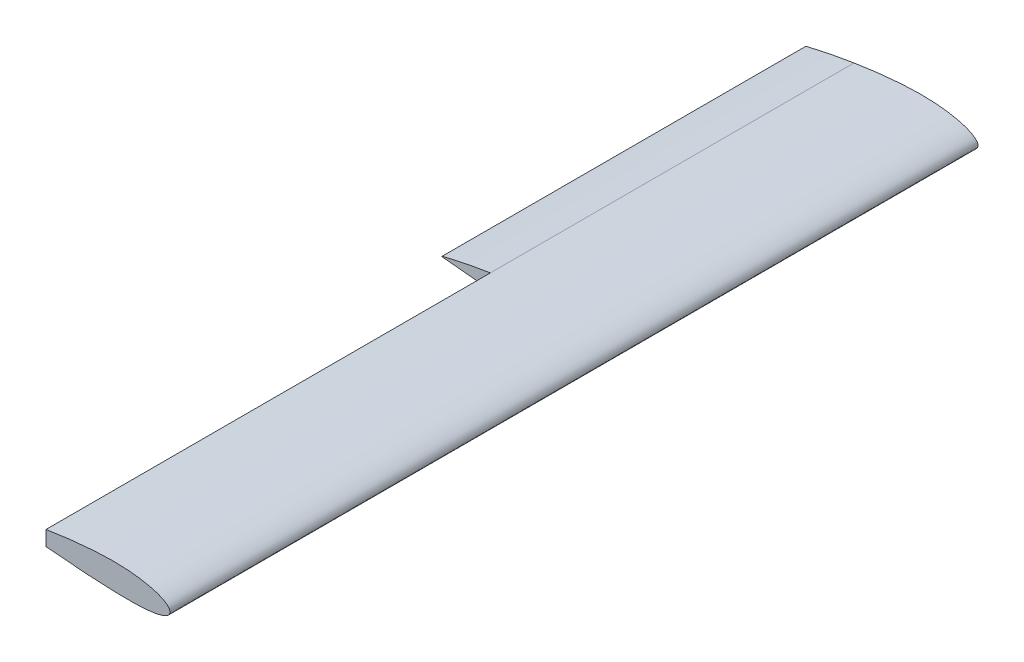
ISO-10303-21;
HEADER;
FILE_DESCRIPTION(('STEP AP214'),'2;1');
FILE_NAME('part.step','',(''),(''),'','','');
FILE_SCHEMA(('AUTOMOTIVE_DESIGN { 1 0 10303 214 1 1 1 1 }'));
ENDSEC;
DATA;
#1=APPLICATION_CONTEXT('core data for automotive mechanical design processes');
#2=APPLICATION_PROTOCOL_DEFINITION('international standard','automotive_design',2000,#1);
#3=PRODUCT_CONTEXT('',#1,'mechanical');
#4=PRODUCT('Part','Part','',(#3));
#5=PRODUCT_RELATED_PRODUCT_CATEGORY('part','',(#4));
#6=PRODUCT_DEFINITION_FORMATION('','',#4);
#7=PRODUCT_DEFINITION_CONTEXT('part definition',#1,'design');
#8=PRODUCT_DEFINITION('design','',#6,#7);
#9=PRODUCT_DEFINITION_SHAPE('','',#8);
#10=(LENGTH_UNIT() NAMED_UNIT(*) SI_UNIT(.MILLI.,.METRE.));
#11=(NAMED_UNIT(*) PLANE_ANGLE_UNIT() SI_UNIT($,.RADIAN.));
#12=(NAMED_UNIT(*) SI_UNIT($,.STERADIAN.) SOLID_ANGLE_UNIT());
#13=UNCERTAINTY_MEASURE_WITH_UNIT(LENGTH_MEASURE(1.E-05),#10,'distance_accuracy_value','');
#14=(GEOMETRIC_REPRESENTATION_CONTEXT(3) GLOBAL_UNCERTAINTY_ASSIGNED_CONTEXT((#13)) GLOBAL_UNIT_ASSIGNED_CONTEXT((#10,
#11,#12)) REPRESENTATION_CONTEXT('',''));
#15=CARTESIAN_POINT('',(0.,0.,0.));
#16=DIRECTION('',(0.,0.,1.));
#17=DIRECTION('',(1.,0.,0.));
#18=AXIS2_PLACEMENT_3D('',#15,#16,#17);
#19=CARTESIAN_POINT('',(-171.846,13.8024377947117,1120.));
#20=DIRECTION('',(1.,0.,0.));
#21=DIRECTION('',(0.,0.,-1.));
#22=AXIS2_PLACEMENT_3D('',#19,#20,#21);
#23=PLANE('',#22);
#24=DIRECTION('',(0.,1.,0.));
#25=VECTOR('',#24,1.);
#26=CARTESIAN_POINT('',(-171.846,13.8024377947117,504.));
#27=LINE('',#26,#25);
#28=CARTESIAN_POINT('',(-171.846,-6.8859458174672,504.));
#29=VERTEX_POINT('',#28);
#30=CARTESIAN_POINT('',(-171.846,13.8024377947117,504.));
#31=VERTEX_POINT('',#30);
#32=EDGE_CURVE('E63',#29,#31,#27,.T.);
#33=ORIENTED_EDGE('',*,*,#32,.F.);
#34=DIRECTION('',(0.,0.,-1.));
#35=VECTOR('',#34,1.);
#36=CARTESIAN_POINT('',(-171.846,-6.8859458174672,1120.));
#37=LINE('',#36,#35);
#38=CARTESIAN_POINT('',(-171.846,-6.8859458174672,1120.));
#39=VERTEX_POINT('',#38);
#40=EDGE_CURVE('E49',#39,#29,#37,.T.);
#41=ORIENTED_EDGE('',*,*,#40,.F.);
#42=DIRECTION('',(0.,-1.,0.));
#43=VECTOR('',#42,1.);
#44=CARTESIAN_POINT('',(-171.846,13.8024377947117,1120.));
#45=LINE('',#44,#43);
#46=CARTESIAN_POINT('',(-171.846,13.8024377947117,1120.));
#47=VERTEX_POINT('',#46);
#48=EDGE_CURVE('E124',#47,#39,#45,.T.);
#49=ORIENTED_EDGE('',*,*,#48,.F.);
#50=DIRECTION('',(0.,0.,-1.));
#51=VECTOR('',#50,1.);
#52=CARTESIAN_POINT('',(-171.846,13.8024377947117,1120.));
#53=LINE('',#52,#51);
#54=EDGE_CURVE('E11',#47,#31,#53,.T.);
#55=ORIENTED_EDGE('',*,*,#54,.T.);
#56=EDGE_LOOP('',(#33,#41,#49,#55));
#57=FACE_BOUND('',#56,.T.);
#58=ADVANCED_FACE('F39',(#57),#23,.F.);
#59=CARTESIAN_POINT('',(-171.846,-6.8859458174672,1120.));
#60=CARTESIAN_POINT('',(-169.445500495057,-7.10059578031412,1120.));
#61=CARTESIAN_POINT('',(-164.120854312164,-7.57671964660847,1120.));
#62=CARTESIAN_POINT('',(-155.798515887061,-8.29774530729197,1120.));
#63=CARTESIAN_POINT('',(-146.82606609712,-9.05269906799401,1120.));
#64=CARTESIAN_POINT('',(-137.692554641866,-9.79026887636794,1120.));
#65=CARTESIAN_POINT('',(-128.453974412743,-10.4981972349087,1120.));
#66=CARTESIAN_POINT('',(-119.166555289154,-11.1621144962876,1120.));
#67=CARTESIAN_POINT('',(-109.88649318211,-11.7661976574275,1120.));
#68=CARTESIAN_POINT('',(-100.683075099608,-12.2946554630794,1120.));
#69=CARTESIAN_POINT('',(-91.6285836977069,-12.7253438577782,1120.));
#70=CARTESIAN_POINT('',(-82.7786921862933,-13.0968894741235,1120.));
#71=CARTESIAN_POINT('',(-74.1699867938844,-13.3842580555591,1120.));
#72=CARTESIAN_POINT('',(-65.8334260635804,-13.5712530139767,1120.));
#73=CARTESIAN_POINT('',(-57.8154332591305,-13.6399608708484,1120.));
#74=CARTESIAN_POINT('',(-50.160721884091,-13.5749224951301,1120.));
#75=CARTESIAN_POINT('',(-42.9121901914159,-13.3629694310149,1120.));
#76=CARTESIAN_POINT('',(-36.1108446538748,-12.9938007179074,1120.));
#77=CARTESIAN_POINT('',(-29.7956590255382,-12.4601537182947,1120.));
#78=CARTESIAN_POINT('',(-24.0033555478795,-11.7578375462022,1120.));
#79=CARTESIAN_POINT('',(-18.7680656078937,-10.8855390450986,1120.));
#80=CARTESIAN_POINT('',(-14.1208062248208,-9.84441937275084,1120.));
#81=CARTESIAN_POINT('',(-10.0886886233779,-8.63729436639388,1120.));
#82=CARTESIAN_POINT('',(-6.69372832298311,-7.26730024454799,1120.));
#83=CARTESIAN_POINT('',(-3.95171243941144,-5.73405902049488,1120.));
#84=CARTESIAN_POINT('',(-1.87387651663263,-4.02782014238744,1120.));
#85=CARTESIAN_POINT('',(-0.485118951259673,-2.11664836578969,1120.));
#86=CARTESIAN_POINT('',(0.129841681260914,-0.0130409179100886,1120.));
#87=CARTESIAN_POINT('',(-0.0566600176232738,2.17249369177211,1120.));
#88=CARTESIAN_POINT('',(-1.05224478430025,4.32261053654658,1120.));
#89=CARTESIAN_POINT('',(-2.78315758748847,6.40154054100684,1120.));
#90=CARTESIAN_POINT('',(-5.22523940459049,8.42890404838555,1120.));
#91=CARTESIAN_POINT('',(-8.3724883945445,10.4021399743308,1120.));
#92=CARTESIAN_POINT('',(-12.2151870573469,12.3056413318673,1120.));
#93=CARTESIAN_POINT('',(-16.7366506098346,14.1166483874969,1120.));
#94=CARTESIAN_POINT('',(-21.913282388799,15.8098332439343,1120.));
#95=CARTESIAN_POINT('',(-27.7153397349146,17.359414779143,1120.));
#96=CARTESIAN_POINT('',(-34.1074981398127,18.7407339465614,1120.));
#97=CARTESIAN_POINT('',(-41.0493501705292,19.9313959586649,1120.));
#98=CARTESIAN_POINT('',(-48.4958757217512,20.9121858558274,1120.));
#99=CARTESIAN_POINT('',(-56.397940476582,21.6677691129187,1120.));
#100=CARTESIAN_POINT('',(-64.7028285837109,22.1871146204139,1120.));
#101=CARTESIAN_POINT('',(-73.3548325723631,22.4639290080596,1120.));
#102=CARTESIAN_POINT('',(-82.2957901982589,22.4959698610246,1120.));
#103=CARTESIAN_POINT('',(-91.448634266557,22.2881550631337,1120.));
#104=CARTESIAN_POINT('',(-100.738687872728,21.8426120642163,1120.));
#105=CARTESIAN_POINT('',(-110.108636731325,21.2290146035072,1120.));
#106=CARTESIAN_POINT('',(-119.5167801635,20.4575897190678,1120.));
#107=CARTESIAN_POINT('',(-128.917260910405,19.5454918191666,1120.));
#108=CARTESIAN_POINT('',(-138.251119140644,18.509863587233,1120.));
#109=CARTESIAN_POINT('',(-147.460336342519,17.3704046575815,1120.));
#110=CARTESIAN_POINT('',(-156.487198096307,16.1422536028045,1120.));
#111=CARTESIAN_POINT('',(-164.597904490877,14.9579757724246,1120.));
#112=CARTESIAN_POINT('',(-169.687195915418,14.1466082189336,1120.));
#113=CARTESIAN_POINT('',(-171.846,13.8024377947117,1120.));
#114=B_SPLINE_CURVE_WITH_KNOTS('',3,(#59,#60,#61,#62,#63,#64,#65,#66,#67,#68,#69,#70,#71,#72,
#73,#74,#75,#76,#77,#78,#79,#80,#81,#82,#83,#84,#85,#86,#87,#88,#89,#90,#91,#92,#93,#94,#95,#96,
#97,#98,#99,#100,#101,#102,#103,#104,#105,#106,#107,#108,#109,#110,#111,#112,#113),
.UNSPECIFIED.,.F.,.F.,(4,1,1,1,1,1,1,1,1,1,1,1,1,1,1,1,1,1,1,1,1,1,1,1,1,1,1,1,1,1,1,1,1,1,1,1,
1,1,1,1,1,1,1,1,1,1,1,1,1,1,1,1,4),(0.,0.0203123247552929,0.0450555987415345,0.07040400679398,
0.0961999993885911,0.122283996098882,0.148495529313847,0.174674438627084,0.200662098763371,
0.226189300320418,0.25107194208632,0.275314951793577,0.298783413997224,0.32134908790219,
0.342891080287374,0.363296498202736,0.382461175238921,0.400290624344227,0.416701457523534,
0.431623657629183,0.445004355911333,0.456814304998181,0.467059338849233,0.475801288432401,
0.483196174748674,0.489556652303001,0.495413049192666,0.501269836081898,0.507639846140704,
0.515071645162168,0.523896327535916,0.534285274767151,0.546312363460599,0.559992259559535,
0.575301318671111,0.592188988742453,0.610584276613813,0.630399623150398,0.651533398098745,
0.673871667406779,0.69728960133289,0.721652736083369,0.746818208479496,0.772636022521288,
0.798804553306532,0.825199510485812,0.851772556299735,0.878359882689069,0.904796908123809,
0.930919587753985,0.956565654369665,0.981575776481233,1.),.UNSPECIFIED.);
#115=DIRECTION('',(0.,0.,-1.));
#116=VECTOR('',#115,1.);
#117=SURFACE_OF_LINEAR_EXTRUSION('',#114,#116);
#118=CARTESIAN_POINT('',(-171.846,-6.8859458174672,0.));
#119=CARTESIAN_POINT('',(-169.445500495057,-7.10059578031412,0.));
#120=CARTESIAN_POINT('',(-164.120854312164,-7.57671964660847,0.));
#121=CARTESIAN_POINT('',(-155.798515887061,-8.29774530729197,0.));
#122=CARTESIAN_POINT('',(-146.82606609712,-9.05269906799401,0.));
#123=CARTESIAN_POINT('',(-137.692554641866,-9.79026887636794,0.));
#124=CARTESIAN_POINT('',(-128.453974412743,-10.4981972349087,0.));
#125=CARTESIAN_POINT('',(-119.166555289154,-11.1621144962876,0.));
#126=CARTESIAN_POINT('',(-109.88649318211,-11.7661976574275,0.));
#127=CARTESIAN_POINT('',(-100.683075099608,-12.2946554630794,0.));
#128=CARTESIAN_POINT('',(-91.6285836977069,-12.7253438577782,0.));
#129=CARTESIAN_POINT('',(-82.7786921862933,-13.0968894741235,0.));
#130=CARTESIAN_POINT('',(-74.1699867938844,-13.3842580555591,0.));
#131=CARTESIAN_POINT('',(-65.8334260635804,-13.5712530139767,0.));
#132=CARTESIAN_POINT('',(-57.8154332591305,-13.6399608708484,0.));
#133=CARTESIAN_POINT('',(-50.160721884091,-13.5749224951301,0.));
#134=CARTESIAN_POINT('',(-42.9121901914159,-13.3629694310149,0.));
#135=CARTESIAN_POINT('',(-36.1108446538748,-12.9938007179074,0.));
#136=CARTESIAN_POINT('',(-29.7956590255382,-12.4601537182947,0.));
#137=CARTESIAN_POINT('',(-24.0033555478795,-11.7578375462022,0.));
#138=CARTESIAN_POINT('',(-18.7680656078937,-10.8855390450986,0.));
#139=CARTESIAN_POINT('',(-14.1208062248208,-9.84441937275084,0.));
#140=CARTESIAN_POINT('',(-10.0886886233779,-8.63729436639388,0.));
#141=CARTESIAN_POINT('',(-6.69372832298311,-7.26730024454799,0.));
#142=CARTESIAN_POINT('',(-3.95171243941144,-5.73405902049488,0.));
#143=CARTESIAN_POINT('',(-1.87387651663263,-4.02782014238744,0.));
#144=CARTESIAN_POINT('',(-0.485118951259673,-2.11664836578969,0.));
#145=CARTESIAN_POINT('',(0.129841681260914,-0.0130409179100886,0.));
#146=CARTESIAN_POINT('',(-0.0566600176232738,2.17249369177211,0.));
#147=CARTESIAN_POINT('',(-1.05224478430025,4.32261053654658,0.));
#148=CARTESIAN_POINT('',(-2.78315758748847,6.40154054100684,0.));
#149=CARTESIAN_POINT('',(-5.22523940459049,8.42890404838555,0.));
#150=CARTESIAN_POINT('',(-8.3724883945445,10.4021399743308,0.));
#151=CARTESIAN_POINT('',(-12.2151870573469,12.3056413318673,0.));
#152=CARTESIAN_POINT('',(-16.7366506098346,14.1166483874969,0.));
#153=CARTESIAN_POINT('',(-21.913282388799,15.8098332439343,0.));
#154=CARTESIAN_POINT('',(-27.7153397349146,17.359414779143,0.));
#155=CARTESIAN_POINT('',(-34.1074981398127,18.7407339465614,0.));
#156=CARTESIAN_POINT('',(-41.0493501705292,19.9313959586649,0.));
#157=CARTESIAN_POINT('',(-48.4958757217512,20.9121858558274,0.));
#158=CARTESIAN_POINT('',(-56.397940476582,21.6677691129187,0.));
#159=CARTESIAN_POINT('',(-64.7028285837109,22.1871146204139,0.));
#160=CARTESIAN_POINT('',(-73.3548325723631,22.4639290080596,0.));
#161=CARTESIAN_POINT('',(-82.2957901982589,22.4959698610246,0.));
#162=CARTESIAN_POINT('',(-91.448634266557,22.2881550631337,0.));
#163=CARTESIAN_POINT('',(-100.738687872728,21.8426120642163,0.));
#164=CARTESIAN_POINT('',(-110.108636731325,21.2290146035072,0.));
#165=CARTESIAN_POINT('',(-119.5167801635,20.4575897190678,0.));
#166=CARTESIAN_POINT('',(-128.917260910405,19.5454918191666,0.));
#167=CARTESIAN_POINT('',(-138.251119140644,18.509863587233,0.));
#168=CARTESIAN_POINT('',(-147.460336342519,17.3704046575815,0.));
#169=CARTESIAN_POINT('',(-156.487198096307,16.1422536028045,0.));
#170=CARTESIAN_POINT('',(-164.597904490877,14.9579757724246,0.));
#171=CARTESIAN_POINT('',(-169.687195915418,14.1466082189336,0.));
#172=CARTESIAN_POINT('',(-171.846,13.8024377947117,0.));
#173=B_SPLINE_CURVE_WITH_KNOTS('',3,(#118,#119,#120,#121,#122,#123,#124,#125,#126,#127,#128,
#129,#130,#131,#132,#133,#134,#135,#136,#137,#138,#139,#140,#141,#142,#143,#144,#145,#146,#147,
#148,#149,#150,#151,#152,#153,#154,#155,#156,#157,#158,#159,#160,#161,#162,#163,#164,#165,#166,
#167,#168,#169,#170,#171,#172),.UNSPECIFIED.,.F.,.F.,(4,1,1,1,1,1,1,1,1,1,1,1,1,1,1,1,1,1,1,1,1,
1,1,1,1,1,1,1,1,1,1,1,1,1,1,1,1,1,1,1,1,1,1,1,1,1,1,1,1,1,1,1,4),(0.,0.0203123247552929,
0.0450555987415345,0.07040400679398,0.0961999993885911,0.122283996098882,0.148495529313847,
0.174674438627084,0.200662098763371,0.226189300320418,0.25107194208632,0.275314951793577,
0.298783413997224,0.32134908790219,0.342891080287374,0.363296498202736,0.382461175238921,
0.400290624344227,0.416701457523534,0.431623657629183,0.445004355911333,0.456814304998181,
0.467059338849233,0.475801288432401,0.483196174748674,0.489556652303001,0.495413049192666,
0.501269836081898,0.507639846140704,0.515071645162168,0.523896327535916,0.534285274767151,
0.546312363460599,0.559992259559535,0.575301318671111,0.592188988742453,0.610584276613813,
0.630399623150398,0.651533398098745,0.673871667406779,0.69728960133289,0.721652736083369,
0.746818208479496,0.772636022521288,0.798804553306532,0.825199510485812,0.851772556299735,
0.878359882689069,0.904796908123809,0.930919587753985,0.956565654369665,0.981575776481233,1.),.UNSPECIFIED.);
#174=CARTESIAN_POINT('',(-171.846,-6.8859458174672,0.));
#175=VERTEX_POINT('',#174);
#176=CARTESIAN_POINT('',(-171.846,13.8024377947117,0.));
#177=VERTEX_POINT('',#176);
#178=EDGE_CURVE('E112',#175,#177,#173,.T.);
#179=ORIENTED_EDGE('',*,*,#178,.T.);
#180=DIRECTION('',(0.,0.,-1.));
#181=VECTOR('',#180,1.);
#182=CARTESIAN_POINT('',(-171.846,13.8024377947117,504.));
#183=LINE('',#182,#181);
#184=EDGE_CURVE('E57',#31,#177,#183,.T.);
#185=ORIENTED_EDGE('',*,*,#184,.F.);
#186=ORIENTED_EDGE('',*,*,#54,.F.);
#187=EDGE_CURVE('E114',#39,#47,#114,.T.);
#188=ORIENTED_EDGE('',*,*,#187,.F.);
#189=ORIENTED_EDGE('',*,*,#40,.T.);
#190=DIRECTION('',(0.,0.,-1.));
#191=VECTOR('',#190,1.);
#192=CARTESIAN_POINT('',(-171.846,-6.8859458174672,504.));
#193=LINE('',#192,#191);
#194=EDGE_CURVE('E116',#29,#175,#193,.T.);
#195=ORIENTED_EDGE('',*,*,#194,.T.);
#196=EDGE_LOOP('',(#179,#185,#186,#188,#189,#195));
#197=FACE_BOUND('',#196,.T.);
#198=ADVANCED_FACE('F41',(#197),#117,.F.);
#199=CARTESIAN_POINT('',(-0.0677546416395283,1.63470036410096,1120.));
#200=DIRECTION('',(0.,0.,1.));
#201=DIRECTION('',(1.,0.,0.));
#202=AXIS2_PLACEMENT_3D('',#199,#200,#201);
#203=PLANE('',#202);
#204=ORIENTED_EDGE('',*,*,#187,.T.);
#205=ORIENTED_EDGE('',*,*,#48,.T.);
#206=EDGE_LOOP('',(#204,#205));
#207=FACE_BOUND('',#206,.T.);
#208=ADVANCED_FACE('F163',(#207),#203,.T.);
#209=CARTESIAN_POINT('',(-0.0677546416395283,1.63470036410096,0.));
#210=DIRECTION('',(0.,0.,1.));
#211=DIRECTION('',(1.,0.,0.));
#212=AXIS2_PLACEMENT_3D('',#209,#210,#211);
#213=PLANE('',#212);
#214=CARTESIAN_POINT('',(-71.603,4.475,0.));
#215=DIRECTION('',(0.,0.,1.));
#216=DIRECTION('',(1.,0.,0.));
#217=AXIS2_PLACEMENT_3D('',#214,#215,#216);
#218=CIRCLE('',#217,12.7);
#219=CARTESIAN_POINT('',(-58.903,4.475,0.));
#220=VERTEX_POINT('',#219);
#221=EDGE_CURVE('E151',#220,#220,#218,.T.);
#222=ORIENTED_EDGE('',*,*,#221,.T.);
#223=EDGE_LOOP('',(#222));
#224=FACE_BOUND('',#223,.T.);
#225=ORIENTED_EDGE('',*,*,#178,.F.);
#226=CARTESIAN_POINT('',(-238.675,-0.37508053676849,0.));
#227=CARTESIAN_POINT('',(-238.666663292953,-0.375050863072439,0.));
#228=CARTESIAN_POINT('',(-238.533564190899,-0.374577109793498,0.));
#229=CARTESIAN_POINT('',(-238.031628616167,-0.459131062708328,0.));
#230=CARTESIAN_POINT('',(-236.918777596451,-0.548714441419959,0.));
#231=CARTESIAN_POINT('',(-235.07567854556,-0.76095517665603,0.));
#232=CARTESIAN_POINT('',(-232.510834876654,-1.02388031131799,0.));
#233=CARTESIAN_POINT('',(-229.242958681744,-1.36749410541668,0.));
#234=CARTESIAN_POINT('',(-225.292785955499,-1.7736519231674,0.));
#235=CARTESIAN_POINT('',(-220.686424670281,-2.24255788349655,0.));
#236=CARTESIAN_POINT('',(-215.453758720331,-2.7672279918527,0.));
#237=CARTESIAN_POINT('',(-209.628691569676,-3.342827920806,0.));
#238=CARTESIAN_POINT('',(-203.248715471556,-3.96366231480069,0.));
#239=CARTESIAN_POINT('',(-196.354667502872,-4.62402766137786,0.));
#240=CARTESIAN_POINT('',(-188.990475626814,-5.31849067483548,0.));
#241=CARTESIAN_POINT('',(-181.202604479842,-6.03903710688791,0.));
#242=CARTESIAN_POINT('',(-175.440788036436,-6.56644350674372,0.));
#243=CARTESIAN_POINT('',(-172.279902363353,-6.84738087112971,0.));
#244=CARTESIAN_POINT('',(-171.846,-6.8859458174672,0.));
#245=B_SPLINE_CURVE_WITH_KNOTS('',3,(#226,#227,#228,#229,#230,#231,#232,#233,#234,#235,#236,
#237,#238,#239,#240,#241,#242,#243,#244),.UNSPECIFIED.,.F.,.F.,(4,1,1,1,1,1,1,1,1,1,1,1,1,1,1,1,
4),(0.,0.000372401287236923,0.0059455462038901,0.0226274177242124,0.0503057556994635,
0.0887948670404106,0.137837653804779,0.197108299470865,0.266215486559006,0.344706014421455,
0.432068697313733,0.527738446472152,0.631100471081385,0.741494566579771,0.858219490153691,
0.980537449100535,1.),.UNSPECIFIED.);
#246=CARTESIAN_POINT('',(-238.675,-0.37508053676849,0.));
#247=VERTEX_POINT('',#246);
#248=EDGE_CURVE('E107',#247,#175,#245,.T.);
#249=ORIENTED_EDGE('',*,*,#248,.F.);
#250=DIRECTION('',(0.,-1.,0.));
#251=VECTOR('',#250,1.);
#252=CARTESIAN_POINT('',(-238.675,0.381187437980616,0.));
#253=LINE('',#252,#251);
#254=CARTESIAN_POINT('',(-238.675,0.381187437980616,0.));
#255=VERTEX_POINT('',#254);
#256=EDGE_CURVE('E180',#255,#247,#253,.T.);
#257=ORIENTED_EDGE('',*,*,#256,.F.);
#258=CARTESIAN_POINT('',(-171.846,13.8024377947117,0.));
#259=CARTESIAN_POINT('',(-172.525257615899,13.6960399387976,0.));
#260=CARTESIAN_POINT('',(-175.933119287711,13.1622377897369,0.));
#261=CARTESIAN_POINT('',(-181.929700077119,12.1426164719057,0.));
#262=CARTESIAN_POINT('',(-189.692578636648,10.7734354892909,0.));
#263=CARTESIAN_POINT('',(-197.014829139419,9.41006841851697,0.));
#264=CARTESIAN_POINT('',(-203.853725709074,8.0798033568466,0.));
#265=CARTESIAN_POINT('',(-210.168184203451,6.80031436592091,0.));
#266=CARTESIAN_POINT('',(-215.920853201955,5.59132147456606,0.));
#267=CARTESIAN_POINT('',(-221.077844696289,4.47147569302521,0.));
#268=CARTESIAN_POINT('',(-225.608999658332,3.4587361930405,0.));
#269=CARTESIAN_POINT('',(-229.487989981543,2.56984478339046,0.));
#270=CARTESIAN_POINT('',(-232.692417395198,1.81993812435626,0.));
#271=CARTESIAN_POINT('',(-235.203893788306,1.22216361687672,0.));
#272=CARTESIAN_POINT('',(-237.008061316949,0.787162185422781,0.));
#273=CARTESIAN_POINT('',(-238.0863502301,0.525005253345914,0.));
#274=CARTESIAN_POINT('',(-238.562115976969,0.408767052230152,0.));
#275=CARTESIAN_POINT('',(-238.675,0.381187437980616,0.));
#276=B_SPLINE_CURVE_WITH_KNOTS('',3,(#258,#259,#260,#261,#262,#263,#264,#265,#266,#267,#268,
#269,#270,#271,#272,#273,#274,#275),.UNSPECIFIED.,.F.,.F.,(4,1,1,1,1,1,1,1,1,1,1,1,1,1,1,4),(0.,
0.0302516964137182,0.151773928333774,0.267626295793447,0.377089871946651,0.479484952377692,
0.574174896828823,0.66056978866967,0.738129948553166,0.806369317748633,0.864858701366983,
0.913228834399553,0.951173207526198,0.978450569044396,0.99488700799438,1.),.UNSPECIFIED.);
#277=EDGE_CURVE('E111',#177,#255,#276,.T.);
#278=ORIENTED_EDGE('',*,*,#277,.F.);
#279=EDGE_LOOP('',(#225,#249,#257,#278));
#280=FACE_BOUND('',#279,.T.);
#281=ADVANCED_FACE('F161',(#224,#280),#213,.F.);
#282=CARTESIAN_POINT('',(-171.846,13.8024377947117,504.));
#283=CARTESIAN_POINT('',(-172.525257615899,13.6960399387976,504.));
#284=CARTESIAN_POINT('',(-175.933119287711,13.1622377897369,504.));
#285=CARTESIAN_POINT('',(-181.929700077119,12.1426164719057,504.));
#286=CARTESIAN_POINT('',(-189.692578636648,10.7734354892909,504.));
#287=CARTESIAN_POINT('',(-197.014829139419,9.41006841851697,504.));
#288=CARTESIAN_POINT('',(-203.853725709074,8.0798033568466,504.));
#289=CARTESIAN_POINT('',(-210.168184203451,6.80031436592091,504.));
#290=CARTESIAN_POINT('',(-215.920853201955,5.59132147456606,504.));
#291=CARTESIAN_POINT('',(-221.077844696289,4.47147569302521,504.));
#292=CARTESIAN_POINT('',(-225.608999658332,3.4587361930405,504.));
#293=CARTESIAN_POINT('',(-229.487989981543,2.56984478339046,504.));
#294=CARTESIAN_POINT('',(-232.692417395198,1.81993812435626,504.));
#295=CARTESIAN_POINT('',(-235.203893788306,1.22216361687672,504.));
#296=CARTESIAN_POINT('',(-237.008061316949,0.787162185422781,504.));
#297=CARTESIAN_POINT('',(-238.0863502301,0.525005253345914,504.));
#298=CARTESIAN_POINT('',(-238.562115976969,0.408767052230152,504.));
#299=CARTESIAN_POINT('',(-238.675,0.381187437980616,504.));
#300=B_SPLINE_CURVE_WITH_KNOTS('',3,(#282,#283,#284,#285,#286,#287,#288,#289,#290,#291,#292,
#293,#294,#295,#296,#297,#298,#299),.UNSPECIFIED.,.F.,.F.,(4,1,1,1,1,1,1,1,1,1,1,1,1,1,1,4),(0.,
0.0302516964137182,0.151773928333774,0.267626295793447,0.377089871946651,0.479484952377692,
0.574174896828823,0.66056978866967,0.738129948553166,0.806369317748633,0.864858701366983,
0.913228834399553,0.951173207526198,0.978450569044396,0.99488700799438,1.),.UNSPECIFIED.);
#301=DIRECTION('',(0.,0.,-1.));
#302=VECTOR('',#301,1.);
#303=SURFACE_OF_LINEAR_EXTRUSION('',#300,#302);
#304=ORIENTED_EDGE('',*,*,#277,.T.);
#305=DIRECTION('',(0.,0.,-1.));
#306=VECTOR('',#305,1.);
#307=CARTESIAN_POINT('',(-238.675,0.381187437980616,504.));
#308=LINE('',#307,#306);
#309=CARTESIAN_POINT('',(-238.675,0.381187437980616,504.));
#310=VERTEX_POINT('',#309);
#311=EDGE_CURVE('E94',#310,#255,#308,.T.);
#312=ORIENTED_EDGE('',*,*,#311,.F.);
#313=EDGE_CURVE('E102',#31,#310,#300,.T.);
#314=ORIENTED_EDGE('',*,*,#313,.F.);
#315=ORIENTED_EDGE('',*,*,#184,.T.);
#316=EDGE_LOOP('',(#304,#312,#314,#315));
#317=FACE_BOUND('',#316,.T.);
#318=ADVANCED_FACE('F109',(#317),#303,.F.);
#319=CARTESIAN_POINT('',(-238.675,0.381187437980616,504.));
#320=DIRECTION('',(1.,0.,0.));
#321=DIRECTION('',(0.,0.,-1.));
#322=AXIS2_PLACEMENT_3D('',#319,#320,#321);
#323=PLANE('',#322);
#324=ORIENTED_EDGE('',*,*,#256,.T.);
#325=DIRECTION('',(0.,0.,-1.));
#326=VECTOR('',#325,1.);
#327=CARTESIAN_POINT('',(-238.675,-0.37508053676849,504.));
#328=LINE('',#327,#326);
#329=CARTESIAN_POINT('',(-238.675,-0.37508053676849,504.));
#330=VERTEX_POINT('',#329);
#331=EDGE_CURVE('E97',#330,#247,#328,.T.);
#332=ORIENTED_EDGE('',*,*,#331,.F.);
#333=DIRECTION('',(0.,-1.,0.));
#334=VECTOR('',#333,1.);
#335=CARTESIAN_POINT('',(-238.675,0.381187437980616,504.));
#336=LINE('',#335,#334);
#337=EDGE_CURVE('E90',#310,#330,#336,.T.);
#338=ORIENTED_EDGE('',*,*,#337,.F.);
#339=ORIENTED_EDGE('',*,*,#311,.T.);
#340=EDGE_LOOP('',(#324,#332,#338,#339));
#341=FACE_BOUND('',#340,.T.);
#342=ADVANCED_FACE('F92',(#341),#323,.F.);
#343=CARTESIAN_POINT('',(-238.675,-0.37508053676849,504.));
#344=CARTESIAN_POINT('',(-238.666663292953,-0.375050863072439,504.));
#345=CARTESIAN_POINT('',(-238.533564190899,-0.374577109793498,504.));
#346=CARTESIAN_POINT('',(-238.031628616167,-0.459131062708328,504.));
#347=CARTESIAN_POINT('',(-236.918777596451,-0.548714441419959,504.));
#348=CARTESIAN_POINT('',(-235.07567854556,-0.76095517665603,504.));
#349=CARTESIAN_POINT('',(-232.510834876654,-1.02388031131799,504.));
#350=CARTESIAN_POINT('',(-229.242958681744,-1.36749410541668,504.));
#351=CARTESIAN_POINT('',(-225.292785955499,-1.7736519231674,504.));
#352=CARTESIAN_POINT('',(-220.686424670281,-2.24255788349655,504.));
#353=CARTESIAN_POINT('',(-215.453758720331,-2.7672279918527,504.));
#354=CARTESIAN_POINT('',(-209.628691569676,-3.342827920806,504.));
#355=CARTESIAN_POINT('',(-203.248715471556,-3.96366231480069,504.));
#356=CARTESIAN_POINT('',(-196.354667502872,-4.62402766137786,504.));
#357=CARTESIAN_POINT('',(-188.990475626814,-5.31849067483548,504.));
#358=CARTESIAN_POINT('',(-181.202604479842,-6.03903710688791,504.));
#359=CARTESIAN_POINT('',(-175.440788036436,-6.56644350674372,504.));
#360=CARTESIAN_POINT('',(-172.279902363353,-6.84738087112971,504.));
#361=CARTESIAN_POINT('',(-171.846,-6.8859458174672,504.));
#362=B_SPLINE_CURVE_WITH_KNOTS('',3,(#343,#344,#345,#346,#347,#348,#349,#350,#351,#352,#353,
#354,#355,#356,#357,#358,#359,#360,#361),.UNSPECIFIED.,.F.,.F.,(4,1,1,1,1,1,1,1,1,1,1,1,1,1,1,1,
4),(0.,0.000372401287236923,0.0059455462038901,0.0226274177242124,0.0503057556994635,
0.0887948670404106,0.137837653804779,0.197108299470865,0.266215486559006,0.344706014421455,
0.432068697313733,0.527738446472152,0.631100471081385,0.741494566579771,0.858219490153691,
0.980537449100535,1.),.UNSPECIFIED.);
#363=DIRECTION('',(0.,0.,-1.));
#364=VECTOR('',#363,1.);
#365=SURFACE_OF_LINEAR_EXTRUSION('',#362,#364);
#366=ORIENTED_EDGE('',*,*,#248,.T.);
#367=ORIENTED_EDGE('',*,*,#194,.F.);
#368=EDGE_CURVE('E101',#330,#29,#362,.T.);
#369=ORIENTED_EDGE('',*,*,#368,.F.);
#370=ORIENTED_EDGE('',*,*,#331,.T.);
#371=EDGE_LOOP('',(#366,#367,#369,#370));
#372=FACE_BOUND('',#371,.T.);
#373=ADVANCED_FACE('F199',(#372),#365,.F.);
#374=CARTESIAN_POINT('',(-205.395489798952,7.76335522020497,504.));
#375=DIRECTION('',(0.,0.,-1.));
#376=DIRECTION('',(-1.,0.,0.));
#377=AXIS2_PLACEMENT_3D('',#374,#375,#376);
#378=PLANE('',#377);
#379=ORIENTED_EDGE('',*,*,#313,.T.);
#380=ORIENTED_EDGE('',*,*,#337,.T.);
#381=ORIENTED_EDGE('',*,*,#368,.T.);
#382=ORIENTED_EDGE('',*,*,#32,.T.);
#383=EDGE_LOOP('',(#379,#380,#381,#382));
#384=FACE_BOUND('',#383,.T.);
#385=ADVANCED_FACE('F105',(#384),#378,.F.);
#386=CARTESIAN_POINT('',(-71.603,4.475,800.));
#387=DIRECTION('',(0.,0.,-1.));
#388=DIRECTION('',(-1.,0.,0.));
#389=AXIS2_PLACEMENT_3D('',#386,#387,#388);
#390=CYLINDRICAL_SURFACE('',#389,12.7);
#391=CARTESIAN_POINT('',(-71.603,4.475,800.));
#392=DIRECTION('',(0.,0.,1.));
#393=DIRECTION('',(1.,0.,0.));
#394=AXIS2_PLACEMENT_3D('',#391,#392,#393);
#395=CIRCLE('',#394,12.7);
#396=CARTESIAN_POINT('',(-58.903,4.475,800.));
#397=VERTEX_POINT('',#396);
#398=EDGE_CURVE('E181',#397,#397,#395,.T.);
#399=ORIENTED_EDGE('',*,*,#398,.T.);
#400=EDGE_LOOP('',(#399));
#401=FACE_BOUND('',#400,.T.);
#402=ORIENTED_EDGE('',*,*,#221,.F.);
#403=EDGE_LOOP('',(#402));
#404=FACE_BOUND('',#403,.T.);
#405=ADVANCED_FACE('F205',(#401,#404),#390,.F.);
#406=CARTESIAN_POINT('',(-71.603,4.475,800.));
#407=DIRECTION('',(0.,0.,1.));
#408=DIRECTION('',(1.,0.,0.));
#409=AXIS2_PLACEMENT_3D('',#406,#407,#408);
#410=PLANE('',#409);
#411=ORIENTED_EDGE('',*,*,#398,.F.);
#412=EDGE_LOOP('',(#411));
#413=FACE_BOUND('',#412,.T.);
#414=ADVANCED_FACE('F210',(#413),#410,.F.);
#415=CLOSED_SHELL('',(#58,#198,#208,#281,#318,#342,#373,#385,#405,#414));
#416=MANIFOLD_SOLID_BREP('B2',#415);
#417=ADVANCED_BREP_SHAPE_REPRESENTATION('',(#18,#416),#14);
#418=SHAPE_DEFINITION_REPRESENTATION(#9,#417);
ENDSEC;
END-ISO-10303-21;
